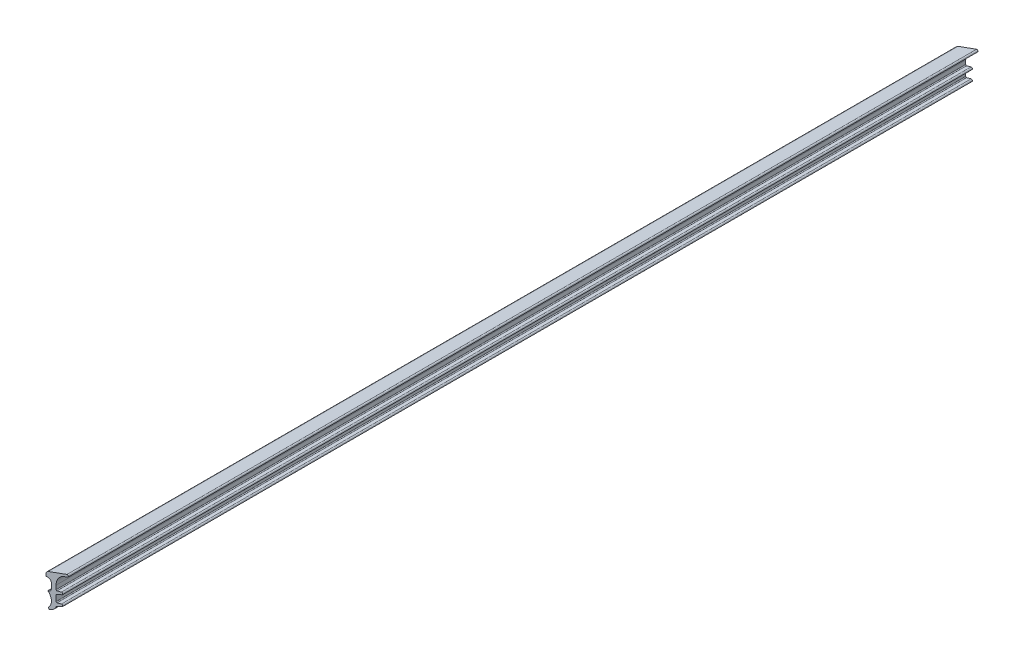
ISO-10303-21;
HEADER;
FILE_DESCRIPTION(('STEP AP214'),'2;1');
FILE_NAME('part.step','',(''),(''),'','','');
FILE_SCHEMA(('AUTOMOTIVE_DESIGN { 1 0 10303 214 1 1 1 1 }'));
ENDSEC;
DATA;
#1=APPLICATION_CONTEXT('core data for automotive mechanical design processes');
#2=APPLICATION_PROTOCOL_DEFINITION('international standard','automotive_design',2000,#1);
#3=PRODUCT_CONTEXT('',#1,'mechanical');
#4=PRODUCT('Part','Part','',(#3));
#5=PRODUCT_RELATED_PRODUCT_CATEGORY('part','',(#4));
#6=PRODUCT_DEFINITION_FORMATION('','',#4);
#7=PRODUCT_DEFINITION_CONTEXT('part definition',#1,'design');
#8=PRODUCT_DEFINITION('design','',#6,#7);
#9=PRODUCT_DEFINITION_SHAPE('','',#8);
#10=(LENGTH_UNIT() NAMED_UNIT(*) SI_UNIT(.MILLI.,.METRE.));
#11=(NAMED_UNIT(*) PLANE_ANGLE_UNIT() SI_UNIT($,.RADIAN.));
#12=(NAMED_UNIT(*) SI_UNIT($,.STERADIAN.) SOLID_ANGLE_UNIT());
#13=UNCERTAINTY_MEASURE_WITH_UNIT(LENGTH_MEASURE(1.E-05),#10,'distance_accuracy_value','');
#14=(GEOMETRIC_REPRESENTATION_CONTEXT(3) GLOBAL_UNCERTAINTY_ASSIGNED_CONTEXT((#13)) GLOBAL_UNIT_ASSIGNED_CONTEXT((#10,
#11,#12)) REPRESENTATION_CONTEXT('',''));
#15=CARTESIAN_POINT('',(0.,0.,0.));
#16=DIRECTION('',(0.,0.,1.));
#17=DIRECTION('',(1.,0.,0.));
#18=AXIS2_PLACEMENT_3D('',#15,#16,#17);
#19=CARTESIAN_POINT('',(-1.78652744552477,1.94857737493925,225.79));
#20=DIRECTION('',(0.,0.,-1.));
#21=DIRECTION('',(-1.,0.,0.));
#22=AXIS2_PLACEMENT_3D('',#19,#20,#21);
#23=CYLINDRICAL_SURFACE('',#22,1.78652744552477);
#24=CARTESIAN_POINT('',(-1.78652744552477,1.94857737493925,-225.79));
#25=DIRECTION('',(0.,0.,-1.));
#26=DIRECTION('',(1.,0.,0.));
#27=AXIS2_PLACEMENT_3D('',#24,#25,#26);
#28=CIRCLE('',#27,1.78652744552477);
#29=CARTESIAN_POINT('',(-1.78652744552477,3.73510482046402,-225.79));
#30=VERTEX_POINT('',#29);
#31=CARTESIAN_POINT('',(0.,1.94857737493925,-225.79));
#32=VERTEX_POINT('',#31);
#33=EDGE_CURVE('E248',#30,#32,#28,.T.);
#34=ORIENTED_EDGE('',*,*,#33,.T.);
#35=DIRECTION('',(0.,0.,-1.));
#36=VECTOR('',#35,1.);
#37=CARTESIAN_POINT('',(0.,1.94857737493925,225.79));
#38=LINE('',#37,#36);
#39=CARTESIAN_POINT('',(0.,1.94857737493925,225.79));
#40=VERTEX_POINT('',#39);
#41=EDGE_CURVE('E11',#40,#32,#38,.T.);
#42=ORIENTED_EDGE('',*,*,#41,.F.);
#43=CARTESIAN_POINT('',(-1.78652744552477,1.94857737493925,225.79));
#44=DIRECTION('',(0.,0.,-1.));
#45=DIRECTION('',(1.,0.,0.));
#46=AXIS2_PLACEMENT_3D('',#43,#44,#45);
#47=CIRCLE('',#46,1.78652744552477);
#48=CARTESIAN_POINT('',(-1.78652744552477,3.73510482046402,225.79));
#49=VERTEX_POINT('',#48);
#50=EDGE_CURVE('E321',#49,#40,#47,.T.);
#51=ORIENTED_EDGE('',*,*,#50,.F.);
#52=DIRECTION('',(0.,0.,-1.));
#53=VECTOR('',#52,1.);
#54=CARTESIAN_POINT('',(-1.78652744552477,3.73510482046402,225.79));
#55=LINE('',#54,#53);
#56=EDGE_CURVE('E244',#49,#30,#55,.T.);
#57=ORIENTED_EDGE('',*,*,#56,.T.);
#58=EDGE_LOOP('',(#34,#42,#51,#57));
#59=FACE_BOUND('',#58,.T.);
#60=ADVANCED_FACE('F45',(#59),#23,.F.);
#61=CARTESIAN_POINT('',(0.,1.94857737493925,225.79));
#62=DIRECTION('',(1.,0.,0.));
#63=DIRECTION('',(0.,1.,0.));
#64=AXIS2_PLACEMENT_3D('',#61,#62,#63);
#65=PLANE('',#64);
#66=DIRECTION('',(0.,-1.,0.));
#67=VECTOR('',#66,1.);
#68=CARTESIAN_POINT('',(0.,1.94857737493925,-225.79));
#69=LINE('',#68,#67);
#70=CARTESIAN_POINT('',(0.,-0.291975050494416,-225.79));
#71=VERTEX_POINT('',#70);
#72=EDGE_CURVE('E252',#32,#71,#69,.T.);
#73=ORIENTED_EDGE('',*,*,#72,.T.);
#74=DIRECTION('',(0.,0.,-1.));
#75=VECTOR('',#74,1.);
#76=CARTESIAN_POINT('',(0.,-0.291975050494416,225.79));
#77=LINE('',#76,#75);
#78=CARTESIAN_POINT('',(0.,-0.291975050494416,225.79));
#79=VERTEX_POINT('',#78);
#80=EDGE_CURVE('E54',#79,#71,#77,.T.);
#81=ORIENTED_EDGE('',*,*,#80,.F.);
#82=DIRECTION('',(0.,-1.,0.));
#83=VECTOR('',#82,1.);
#84=CARTESIAN_POINT('',(0.,1.94857737493925,225.79));
#85=LINE('',#84,#83);
#86=EDGE_CURVE('E156',#40,#79,#85,.T.);
#87=ORIENTED_EDGE('',*,*,#86,.F.);
#88=ORIENTED_EDGE('',*,*,#41,.T.);
#89=EDGE_LOOP('',(#73,#81,#87,#88));
#90=FACE_BOUND('',#89,.T.);
#91=ADVANCED_FACE('F506',(#90),#65,.F.);
#92=CARTESIAN_POINT('',(-1.78652744552476,-0.291975050494416,225.79));
#93=DIRECTION('',(0.,0.,-1.));
#94=DIRECTION('',(-1.,0.,0.));
#95=AXIS2_PLACEMENT_3D('',#92,#93,#94);
#96=CYLINDRICAL_SURFACE('',#95,1.78652744552476);
#97=CARTESIAN_POINT('',(-1.78652744552476,-0.291975050494416,-225.79));
#98=DIRECTION('',(0.,0.,-1.));
#99=DIRECTION('',(1.,0.,0.));
#100=AXIS2_PLACEMENT_3D('',#97,#98,#99);
#101=CIRCLE('',#100,1.78652744552476);
#102=CARTESIAN_POINT('',(-1.78652744552476,-2.07850249601918,-225.79));
#103=VERTEX_POINT('',#102);
#104=EDGE_CURVE('E255',#71,#103,#101,.T.);
#105=ORIENTED_EDGE('',*,*,#104,.T.);
#106=DIRECTION('',(0.,0.,-1.));
#107=VECTOR('',#106,1.);
#108=CARTESIAN_POINT('',(-1.78652744552476,-2.07850249601918,225.79));
#109=LINE('',#108,#107);
#110=CARTESIAN_POINT('',(-1.78652744552476,-2.07850249601918,225.79));
#111=VERTEX_POINT('',#110);
#112=EDGE_CURVE('E400',#111,#103,#109,.T.);
#113=ORIENTED_EDGE('',*,*,#112,.F.);
#114=CARTESIAN_POINT('',(-1.78652744552476,-0.291975050494416,225.79));
#115=DIRECTION('',(0.,0.,-1.));
#116=DIRECTION('',(1.,0.,0.));
#117=AXIS2_PLACEMENT_3D('',#114,#115,#116);
#118=CIRCLE('',#117,1.78652744552476);
#119=EDGE_CURVE('E410',#79,#111,#118,.T.);
#120=ORIENTED_EDGE('',*,*,#119,.F.);
#121=ORIENTED_EDGE('',*,*,#80,.T.);
#122=EDGE_LOOP('',(#105,#113,#120,#121));
#123=FACE_BOUND('',#122,.T.);
#124=ADVANCED_FACE('F408',(#123),#96,.F.);
#125=CARTESIAN_POINT('',(-4.38380391574828,-5.6216307671915,225.79));
#126=DIRECTION('',(0.,0.,-1.));
#127=DIRECTION('',(-1.,0.,0.));
#128=AXIS2_PLACEMENT_3D('',#125,#126,#127);
#129=CYLINDRICAL_SURFACE('',#128,4.39313134435534);
#130=CARTESIAN_POINT('',(-4.38380391574828,-5.6216307671915,-225.79));
#131=DIRECTION('',(0.,0.,-1.));
#132=DIRECTION('',(1.,0.,0.));
#133=AXIS2_PLACEMENT_3D('',#130,#131,#132);
#134=CIRCLE('',#133,4.39313134435534);
#135=CARTESIAN_POINT('',(-1.34801706246346,-8.79709942396965,-225.79));
#136=VERTEX_POINT('',#135);
#137=EDGE_CURVE('E258',#103,#136,#134,.T.);
#138=ORIENTED_EDGE('',*,*,#137,.T.);
#139=DIRECTION('',(0.,0.,-1.));
#140=VECTOR('',#139,1.);
#141=CARTESIAN_POINT('',(-1.34801706246346,-8.79709942396965,225.79));
#142=LINE('',#141,#140);
#143=CARTESIAN_POINT('',(-1.34801706246346,-8.79709942396965,225.79));
#144=VERTEX_POINT('',#143);
#145=EDGE_CURVE('E396',#144,#136,#142,.T.);
#146=ORIENTED_EDGE('',*,*,#145,.F.);
#147=CARTESIAN_POINT('',(-4.38380391574828,-5.6216307671915,225.79));
#148=DIRECTION('',(0.,0.,-1.));
#149=DIRECTION('',(1.,0.,0.));
#150=AXIS2_PLACEMENT_3D('',#147,#148,#149);
#151=CIRCLE('',#150,4.39313134435534);
#152=EDGE_CURVE('E429',#111,#144,#151,.T.);
#153=ORIENTED_EDGE('',*,*,#152,.F.);
#154=ORIENTED_EDGE('',*,*,#112,.T.);
#155=EDGE_LOOP('',(#138,#146,#153,#154));
#156=FACE_BOUND('',#155,.T.);
#157=ADVANCED_FACE('F419',(#156),#129,.F.);
#158=CARTESIAN_POINT('',(-0.97765368561212,-9.18450386033098,225.79));
#159=DIRECTION('',(0.,0.,-1.));
#160=DIRECTION('',(-1.,0.,0.));
#161=AXIS2_PLACEMENT_3D('',#158,#159,#160);
#162=CYLINDRICAL_SURFACE('',#161,0.535958233657416);
#163=CARTESIAN_POINT('',(-0.97765368561212,-9.18450386033098,-225.79));
#164=DIRECTION('',(0.,0.,1.));
#165=DIRECTION('',(1.,0.,0.));
#166=AXIS2_PLACEMENT_3D('',#163,#164,#165);
#167=CIRCLE('',#166,0.535958233657416);
#168=CARTESIAN_POINT('',(-0.82999058633459,-9.69971919136931,-225.79));
#169=VERTEX_POINT('',#168);
#170=EDGE_CURVE('E261',#136,#169,#167,.T.);
#171=ORIENTED_EDGE('',*,*,#170,.T.);
#172=DIRECTION('',(0.,0.,-1.));
#173=VECTOR('',#172,1.);
#174=CARTESIAN_POINT('',(-0.82999058633459,-9.69971919136931,225.79));
#175=LINE('',#174,#173);
#176=CARTESIAN_POINT('',(-0.82999058633459,-9.69971919136931,225.79));
#177=VERTEX_POINT('',#176);
#178=EDGE_CURVE('E392',#177,#169,#175,.T.);
#179=ORIENTED_EDGE('',*,*,#178,.F.);
#180=CARTESIAN_POINT('',(-0.97765368561212,-9.18450386033098,225.79));
#181=DIRECTION('',(0.,0.,1.));
#182=DIRECTION('',(1.,0.,0.));
#183=AXIS2_PLACEMENT_3D('',#180,#181,#182);
#184=CIRCLE('',#183,0.535958233657416);
#185=EDGE_CURVE('E425',#144,#177,#184,.T.);
#186=ORIENTED_EDGE('',*,*,#185,.F.);
#187=ORIENTED_EDGE('',*,*,#145,.T.);
#188=EDGE_LOOP('',(#171,#179,#186,#187));
#189=FACE_BOUND('',#188,.T.);
#190=ADVANCED_FACE('F423',(#189),#162,.T.);
#191=CARTESIAN_POINT('',(-2.18905187352212,-4.95778153459788,225.79));
#192=DIRECTION('',(0.,0.,-1.));
#193=DIRECTION('',(-1.,0.,0.));
#194=AXIS2_PLACEMENT_3D('',#191,#192,#193);
#195=CYLINDRICAL_SURFACE('',#194,4.93285113530084);
#196=CARTESIAN_POINT('',(-2.18905187352212,-4.95778153459788,-225.79));
#197=DIRECTION('',(0.,0.,1.));
#198=DIRECTION('',(1.,0.,0.));
#199=AXIS2_PLACEMENT_3D('',#196,#197,#198);
#200=CIRCLE('',#199,4.93285113530084);
#201=CARTESIAN_POINT('',(2.32248567918233,-6.95253696661863,-225.79));
#202=VERTEX_POINT('',#201);
#203=EDGE_CURVE('E264',#169,#202,#200,.T.);
#204=ORIENTED_EDGE('',*,*,#203,.T.);
#205=DIRECTION('',(0.,0.,-1.));
#206=VECTOR('',#205,1.);
#207=CARTESIAN_POINT('',(2.32248567918233,-6.95253696661863,225.79));
#208=LINE('',#207,#206);
#209=CARTESIAN_POINT('',(2.32248567918233,-6.95253696661863,225.79));
#210=VERTEX_POINT('',#209);
#211=EDGE_CURVE('E388',#210,#202,#208,.T.);
#212=ORIENTED_EDGE('',*,*,#211,.F.);
#213=CARTESIAN_POINT('',(-2.18905187352212,-4.95778153459788,225.79));
#214=DIRECTION('',(0.,0.,1.));
#215=DIRECTION('',(1.,0.,0.));
#216=AXIS2_PLACEMENT_3D('',#213,#214,#215);
#217=CIRCLE('',#216,4.93285113530084);
#218=EDGE_CURVE('E428',#177,#210,#217,.T.);
#219=ORIENTED_EDGE('',*,*,#218,.F.);
#220=ORIENTED_EDGE('',*,*,#178,.T.);
#221=EDGE_LOOP('',(#204,#212,#219,#220));
#222=FACE_BOUND('',#221,.T.);
#223=ADVANCED_FACE('F519',(#222),#195,.T.);
#224=CARTESIAN_POINT('',(2.6797911682873,-6.95253696661863,225.79));
#225=DIRECTION('',(0.,0.,-1.));
#226=DIRECTION('',(-1.,0.,0.));
#227=AXIS2_PLACEMENT_3D('',#224,#225,#226);
#228=CYLINDRICAL_SURFACE('',#227,0.357305489104969);
#229=CARTESIAN_POINT('',(2.6797911682873,-6.95253696661863,-225.79));
#230=DIRECTION('',(0.,0.,-1.));
#231=DIRECTION('',(1.,0.,0.));
#232=AXIS2_PLACEMENT_3D('',#229,#230,#231);
#233=CIRCLE('',#232,0.357305489104969);
#234=CARTESIAN_POINT('',(2.53974358834427,-6.62382145451638,-225.79));
#235=VERTEX_POINT('',#234);
#236=EDGE_CURVE('E267',#202,#235,#233,.T.);
#237=ORIENTED_EDGE('',*,*,#236,.T.);
#238=DIRECTION('',(0.,0.,-1.));
#239=VECTOR('',#238,1.);
#240=CARTESIAN_POINT('',(2.53974358834427,-6.62382145451638,225.79));
#241=LINE('',#240,#239);
#242=CARTESIAN_POINT('',(2.53974358834427,-6.62382145451638,225.79));
#243=VERTEX_POINT('',#242);
#244=EDGE_CURVE('E384',#243,#235,#241,.T.);
#245=ORIENTED_EDGE('',*,*,#244,.F.);
#246=CARTESIAN_POINT('',(2.6797911682873,-6.95253696661863,225.79));
#247=DIRECTION('',(0.,0.,-1.));
#248=DIRECTION('',(1.,0.,0.));
#249=AXIS2_PLACEMENT_3D('',#246,#247,#248);
#250=CIRCLE('',#249,0.357305489104969);
#251=EDGE_CURVE('E433',#210,#243,#250,.T.);
#252=ORIENTED_EDGE('',*,*,#251,.F.);
#253=ORIENTED_EDGE('',*,*,#211,.T.);
#254=EDGE_LOOP('',(#237,#245,#252,#253));
#255=FACE_BOUND('',#254,.T.);
#256=ADVANCED_FACE('F522',(#255),#228,.F.);
#257=CARTESIAN_POINT('',(2.53974358834427,-6.62382145451638,225.79));
#258=DIRECTION('',(-0.391954739609082,0.919984501009651,0.));
#259=DIRECTION('',(-0.919984501009651,-0.391954739609082,0.));
#260=AXIS2_PLACEMENT_3D('',#257,#258,#259);
#261=PLANE('',#260);
#262=DIRECTION('',(0.919984501009651,0.391954739609082,0.));
#263=VECTOR('',#262,1.);
#264=CARTESIAN_POINT('',(2.53974358834427,-6.62382145451638,-225.79));
#265=LINE('',#264,#263);
#266=CARTESIAN_POINT('',(5.30072267607704,-5.44752029051768,-225.79));
#267=VERTEX_POINT('',#266);
#268=EDGE_CURVE('E270',#235,#267,#265,.T.);
#269=ORIENTED_EDGE('',*,*,#268,.T.);
#270=DIRECTION('',(0.,0.,-1.));
#271=VECTOR('',#270,1.);
#272=CARTESIAN_POINT('',(5.30072267607704,-5.44752029051768,225.79));
#273=LINE('',#272,#271);
#274=CARTESIAN_POINT('',(5.30072267607704,-5.44752029051768,225.79));
#275=VERTEX_POINT('',#274);
#276=EDGE_CURVE('E380',#275,#267,#273,.T.);
#277=ORIENTED_EDGE('',*,*,#276,.F.);
#278=DIRECTION('',(0.919984501009651,0.391954739609082,0.));
#279=VECTOR('',#278,1.);
#280=CARTESIAN_POINT('',(2.53974358834427,-6.62382145451638,225.79));
#281=LINE('',#280,#279);
#282=EDGE_CURVE('E440',#243,#275,#281,.T.);
#283=ORIENTED_EDGE('',*,*,#282,.F.);
#284=ORIENTED_EDGE('',*,*,#244,.T.);
#285=EDGE_LOOP('',(#269,#277,#283,#284));
#286=FACE_BOUND('',#285,.T.);
#287=ADVANCED_FACE('F526',(#286),#261,.F.);
#288=CARTESIAN_POINT('',(5.0906513061625,-4.95444702236435,225.79));
#289=DIRECTION('',(0.,0.,-1.));
#290=DIRECTION('',(-1.,0.,0.));
#291=AXIS2_PLACEMENT_3D('',#288,#289,#290);
#292=CYLINDRICAL_SURFACE('',#291,0.535958233657415);
#293=CARTESIAN_POINT('',(5.0906513061625,-4.95444702236435,-225.79));
#294=DIRECTION('',(0.,0.,1.));
#295=DIRECTION('',(1.,0.,0.));
#296=AXIS2_PLACEMENT_3D('',#293,#294,#295);
#297=CIRCLE('',#296,0.535958233657415);
#298=CARTESIAN_POINT('',(4.94912002109639,-4.43751363828792,-225.79));
#299=VERTEX_POINT('',#298);
#300=EDGE_CURVE('E273',#267,#299,#297,.T.);
#301=ORIENTED_EDGE('',*,*,#300,.T.);
#302=DIRECTION('',(0.,0.,-1.));
#303=VECTOR('',#302,1.);
#304=CARTESIAN_POINT('',(4.94912002109639,-4.43751363828792,225.79));
#305=LINE('',#304,#303);
#306=CARTESIAN_POINT('',(4.94912002109639,-4.43751363828792,225.79));
#307=VERTEX_POINT('',#306);
#308=EDGE_CURVE('E376',#307,#299,#305,.T.);
#309=ORIENTED_EDGE('',*,*,#308,.F.);
#310=CARTESIAN_POINT('',(5.0906513061625,-4.95444702236435,225.79));
#311=DIRECTION('',(0.,0.,1.));
#312=DIRECTION('',(1.,0.,0.));
#313=AXIS2_PLACEMENT_3D('',#310,#311,#312);
#314=CIRCLE('',#313,0.535958233657415);
#315=EDGE_CURVE('E443',#275,#307,#314,.T.);
#316=ORIENTED_EDGE('',*,*,#315,.F.);
#317=ORIENTED_EDGE('',*,*,#276,.T.);
#318=EDGE_LOOP('',(#301,#309,#316,#317));
#319=FACE_BOUND('',#318,.T.);
#320=ADVANCED_FACE('F530',(#319),#292,.T.);
#321=CARTESIAN_POINT('',(4.94912002109639,-4.43751363828792,225.79));
#322=DIRECTION('',(0.2640714820263,-0.964503111648912,0.));
#323=DIRECTION('',(0.964503111648912,0.2640714820263,0.));
#324=AXIS2_PLACEMENT_3D('',#321,#322,#323);
#325=PLANE('',#324);
#326=DIRECTION('',(-0.964503111648912,-0.2640714820263,0.));
#327=VECTOR('',#326,1.);
#328=CARTESIAN_POINT('',(4.94912002109639,-4.43751363828792,-225.79));
#329=LINE('',#328,#327);
#330=CARTESIAN_POINT('',(2.77414535833138,-5.03300034603332,-225.79));
#331=VERTEX_POINT('',#330);
#332=EDGE_CURVE('E276',#299,#331,#329,.T.);
#333=ORIENTED_EDGE('',*,*,#332,.T.);
#334=DIRECTION('',(0.,0.,-1.));
#335=VECTOR('',#334,1.);
#336=CARTESIAN_POINT('',(2.77414535833138,-5.03300034603332,225.79));
#337=LINE('',#336,#335);
#338=CARTESIAN_POINT('',(2.77414535833138,-5.03300034603332,225.79));
#339=VERTEX_POINT('',#338);
#340=EDGE_CURVE('E372',#339,#331,#337,.T.);
#341=ORIENTED_EDGE('',*,*,#340,.F.);
#342=DIRECTION('',(-0.964503111648912,-0.2640714820263,0.));
#343=VECTOR('',#342,1.);
#344=CARTESIAN_POINT('',(4.94912002109639,-4.43751363828792,225.79));
#345=LINE('',#344,#343);
#346=EDGE_CURVE('E446',#307,#339,#345,.T.);
#347=ORIENTED_EDGE('',*,*,#346,.F.);
#348=ORIENTED_EDGE('',*,*,#308,.T.);
#349=EDGE_LOOP('',(#333,#341,#347,#348));
#350=FACE_BOUND('',#349,.T.);
#351=ADVANCED_FACE('F534',(#350),#325,.F.);
#352=CARTESIAN_POINT('',(2.6797911682873,-4.68837808998234,225.79));
#353=DIRECTION('',(0.,0.,-1.));
#354=DIRECTION('',(-1.,0.,0.));
#355=AXIS2_PLACEMENT_3D('',#352,#353,#354);
#356=CYLINDRICAL_SURFACE('',#355,0.357305489104968);
#357=CARTESIAN_POINT('',(2.6797911682873,-4.68837808998234,-225.79));
#358=DIRECTION('',(0.,0.,-1.));
#359=DIRECTION('',(1.,0.,0.));
#360=AXIS2_PLACEMENT_3D('',#357,#358,#359);
#361=CIRCLE('',#360,0.357305489104968);
#362=CARTESIAN_POINT('',(2.32248567918233,-4.68837808998234,-225.79));
#363=VERTEX_POINT('',#362);
#364=EDGE_CURVE('E279',#331,#363,#361,.T.);
#365=ORIENTED_EDGE('',*,*,#364,.T.);
#366=DIRECTION('',(0.,0.,-1.));
#367=VECTOR('',#366,1.);
#368=CARTESIAN_POINT('',(2.32248567918233,-4.68837808998234,225.79));
#369=LINE('',#368,#367);
#370=CARTESIAN_POINT('',(2.32248567918233,-4.68837808998234,225.79));
#371=VERTEX_POINT('',#370);
#372=EDGE_CURVE('E368',#371,#363,#369,.T.);
#373=ORIENTED_EDGE('',*,*,#372,.F.);
#374=CARTESIAN_POINT('',(2.6797911682873,-4.68837808998234,225.79));
#375=DIRECTION('',(0.,0.,-1.));
#376=DIRECTION('',(1.,0.,0.));
#377=AXIS2_PLACEMENT_3D('',#374,#375,#376);
#378=CIRCLE('',#377,0.357305489104968);
#379=EDGE_CURVE('E449',#339,#371,#378,.T.);
#380=ORIENTED_EDGE('',*,*,#379,.F.);
#381=ORIENTED_EDGE('',*,*,#340,.T.);
#382=EDGE_LOOP('',(#365,#373,#380,#381));
#383=FACE_BOUND('',#382,.T.);
#384=ADVANCED_FACE('F538',(#383),#356,.F.);
#385=CARTESIAN_POINT('',(2.32248567918233,-4.68837808998234,225.79));
#386=DIRECTION('',(-1.,0.,0.));
#387=DIRECTION('',(0.,-1.,0.));
#388=AXIS2_PLACEMENT_3D('',#385,#386,#387);
#389=PLANE('',#388);
#390=DIRECTION('',(0.,1.,0.));
#391=VECTOR('',#390,1.);
#392=CARTESIAN_POINT('',(2.32248567918233,-4.68837808998234,-225.79));
#393=LINE('',#392,#391);
#394=CARTESIAN_POINT('',(2.32248567918233,-1.8190303702324,-225.79));
#395=VERTEX_POINT('',#394);
#396=EDGE_CURVE('E282',#363,#395,#393,.T.);
#397=ORIENTED_EDGE('',*,*,#396,.T.);
#398=DIRECTION('',(0.,0.,-1.));
#399=VECTOR('',#398,1.);
#400=CARTESIAN_POINT('',(2.32248567918233,-1.8190303702324,225.79));
#401=LINE('',#400,#399);
#402=CARTESIAN_POINT('',(2.32248567918233,-1.8190303702324,225.79));
#403=VERTEX_POINT('',#402);
#404=EDGE_CURVE('E364',#403,#395,#401,.T.);
#405=ORIENTED_EDGE('',*,*,#404,.F.);
#406=DIRECTION('',(0.,1.,0.));
#407=VECTOR('',#406,1.);
#408=CARTESIAN_POINT('',(2.32248567918233,-4.68837808998234,225.79));
#409=LINE('',#408,#407);
#410=EDGE_CURVE('E452',#371,#403,#409,.T.);
#411=ORIENTED_EDGE('',*,*,#410,.F.);
#412=ORIENTED_EDGE('',*,*,#372,.T.);
#413=EDGE_LOOP('',(#397,#405,#411,#412));
#414=FACE_BOUND('',#413,.T.);
#415=ADVANCED_FACE('F542',(#414),#389,.F.);
#416=CARTESIAN_POINT('',(2.6797911682873,-1.8190303702324,225.79));
#417=DIRECTION('',(0.,0.,-1.));
#418=DIRECTION('',(-1.,0.,0.));
#419=AXIS2_PLACEMENT_3D('',#416,#417,#418);
#420=CYLINDRICAL_SURFACE('',#419,0.357305489104968);
#421=CARTESIAN_POINT('',(2.6797911682873,-1.8190303702324,-225.79));
#422=DIRECTION('',(0.,0.,-1.));
#423=DIRECTION('',(1.,0.,0.));
#424=AXIS2_PLACEMENT_3D('',#421,#422,#423);
#425=CIRCLE('',#424,0.357305489104968);
#426=CARTESIAN_POINT('',(2.53974358834427,-1.49031485813016,-225.79));
#427=VERTEX_POINT('',#426);
#428=EDGE_CURVE('E285',#395,#427,#425,.T.);
#429=ORIENTED_EDGE('',*,*,#428,.T.);
#430=DIRECTION('',(0.,0.,-1.));
#431=VECTOR('',#430,1.);
#432=CARTESIAN_POINT('',(2.53974358834427,-1.49031485813016,225.79));
#433=LINE('',#432,#431);
#434=CARTESIAN_POINT('',(2.53974358834427,-1.49031485813016,225.79));
#435=VERTEX_POINT('',#434);
#436=EDGE_CURVE('E360',#435,#427,#433,.T.);
#437=ORIENTED_EDGE('',*,*,#436,.F.);
#438=CARTESIAN_POINT('',(2.6797911682873,-1.8190303702324,225.79));
#439=DIRECTION('',(0.,0.,-1.));
#440=DIRECTION('',(1.,0.,0.));
#441=AXIS2_PLACEMENT_3D('',#438,#439,#440);
#442=CIRCLE('',#441,0.357305489104968);
#443=EDGE_CURVE('E455',#403,#435,#442,.T.);
#444=ORIENTED_EDGE('',*,*,#443,.F.);
#445=ORIENTED_EDGE('',*,*,#404,.T.);
#446=EDGE_LOOP('',(#429,#437,#444,#445));
#447=FACE_BOUND('',#446,.T.);
#448=ADVANCED_FACE('F546',(#447),#420,.F.);
#449=CARTESIAN_POINT('',(2.53974358834427,-1.49031485813016,225.79));
#450=DIRECTION('',(-0.391954739609082,0.919984501009651,0.));
#451=DIRECTION('',(-0.919984501009651,-0.391954739609082,0.));
#452=AXIS2_PLACEMENT_3D('',#449,#450,#451);
#453=PLANE('',#452);
#454=DIRECTION('',(0.919984501009651,0.391954739609082,0.));
#455=VECTOR('',#454,1.);
#456=CARTESIAN_POINT('',(2.53974358834427,-1.49031485813016,-225.79));
#457=LINE('',#456,#455);
#458=CARTESIAN_POINT('',(5.30072267607704,-0.314013694131456,-225.79));
#459=VERTEX_POINT('',#458);
#460=EDGE_CURVE('E288',#427,#459,#457,.T.);
#461=ORIENTED_EDGE('',*,*,#460,.T.);
#462=DIRECTION('',(0.,0.,-1.));
#463=VECTOR('',#462,1.);
#464=CARTESIAN_POINT('',(5.30072267607704,-0.314013694131456,225.79));
#465=LINE('',#464,#463);
#466=CARTESIAN_POINT('',(5.30072267607704,-0.314013694131456,225.79));
#467=VERTEX_POINT('',#466);
#468=EDGE_CURVE('E356',#467,#459,#465,.T.);
#469=ORIENTED_EDGE('',*,*,#468,.F.);
#470=DIRECTION('',(0.919984501009651,0.391954739609082,0.));
#471=VECTOR('',#470,1.);
#472=CARTESIAN_POINT('',(2.53974358834427,-1.49031485813016,225.79));
#473=LINE('',#472,#471);
#474=EDGE_CURVE('E458',#435,#467,#473,.T.);
#475=ORIENTED_EDGE('',*,*,#474,.F.);
#476=ORIENTED_EDGE('',*,*,#436,.T.);
#477=EDGE_LOOP('',(#461,#469,#475,#476));
#478=FACE_BOUND('',#477,.T.);
#479=ADVANCED_FACE('F550',(#478),#453,.F.);
#480=CARTESIAN_POINT('',(5.0906513061625,0.179059574021876,225.79));
#481=DIRECTION('',(0.,0.,-1.));
#482=DIRECTION('',(-1.,0.,0.));
#483=AXIS2_PLACEMENT_3D('',#480,#481,#482);
#484=CYLINDRICAL_SURFACE('',#483,0.535958233657416);
#485=CARTESIAN_POINT('',(5.0906513061625,0.179059574021876,-225.79));
#486=DIRECTION('',(0.,0.,1.));
#487=DIRECTION('',(1.,0.,0.));
#488=AXIS2_PLACEMENT_3D('',#485,#486,#487);
#489=CIRCLE('',#488,0.535958233657416);
#490=CARTESIAN_POINT('',(4.94912002109639,0.695992958098308,-225.79));
#491=VERTEX_POINT('',#490);
#492=EDGE_CURVE('E291',#459,#491,#489,.T.);
#493=ORIENTED_EDGE('',*,*,#492,.T.);
#494=DIRECTION('',(0.,0.,-1.));
#495=VECTOR('',#494,1.);
#496=CARTESIAN_POINT('',(4.94912002109639,0.695992958098308,225.79));
#497=LINE('',#496,#495);
#498=CARTESIAN_POINT('',(4.94912002109639,0.695992958098308,225.79));
#499=VERTEX_POINT('',#498);
#500=EDGE_CURVE('E352',#499,#491,#497,.T.);
#501=ORIENTED_EDGE('',*,*,#500,.F.);
#502=CARTESIAN_POINT('',(5.0906513061625,0.179059574021876,225.79));
#503=DIRECTION('',(0.,0.,1.));
#504=DIRECTION('',(1.,0.,0.));
#505=AXIS2_PLACEMENT_3D('',#502,#503,#504);
#506=CIRCLE('',#505,0.535958233657416);
#507=EDGE_CURVE('E461',#467,#499,#506,.T.);
#508=ORIENTED_EDGE('',*,*,#507,.F.);
#509=ORIENTED_EDGE('',*,*,#468,.T.);
#510=EDGE_LOOP('',(#493,#501,#508,#509));
#511=FACE_BOUND('',#510,.T.);
#512=ADVANCED_FACE('F554',(#511),#484,.T.);
#513=CARTESIAN_POINT('',(4.94912002109639,0.695992958098308,225.79));
#514=DIRECTION('',(0.2640714820263,-0.964503111648912,0.));
#515=DIRECTION('',(0.964503111648912,0.2640714820263,0.));
#516=AXIS2_PLACEMENT_3D('',#513,#514,#515);
#517=PLANE('',#516);
#518=DIRECTION('',(-0.964503111648912,-0.2640714820263,0.));
#519=VECTOR('',#518,1.);
#520=CARTESIAN_POINT('',(4.94912002109639,0.695992958098308,-225.79));
#521=LINE('',#520,#519);
#522=CARTESIAN_POINT('',(2.77414535833138,0.100506250352905,-225.79));
#523=VERTEX_POINT('',#522);
#524=EDGE_CURVE('E294',#491,#523,#521,.T.);
#525=ORIENTED_EDGE('',*,*,#524,.T.);
#526=DIRECTION('',(0.,0.,-1.));
#527=VECTOR('',#526,1.);
#528=CARTESIAN_POINT('',(2.77414535833138,0.100506250352905,225.79));
#529=LINE('',#528,#527);
#530=CARTESIAN_POINT('',(2.77414535833138,0.100506250352905,225.79));
#531=VERTEX_POINT('',#530);
#532=EDGE_CURVE('E348',#531,#523,#529,.T.);
#533=ORIENTED_EDGE('',*,*,#532,.F.);
#534=DIRECTION('',(-0.964503111648912,-0.2640714820263,0.));
#535=VECTOR('',#534,1.);
#536=CARTESIAN_POINT('',(4.94912002109639,0.695992958098308,225.79));
#537=LINE('',#536,#535);
#538=EDGE_CURVE('E464',#499,#531,#537,.T.);
#539=ORIENTED_EDGE('',*,*,#538,.F.);
#540=ORIENTED_EDGE('',*,*,#500,.T.);
#541=EDGE_LOOP('',(#525,#533,#539,#540));
#542=FACE_BOUND('',#541,.T.);
#543=ADVANCED_FACE('F558',(#542),#517,.F.);
#544=CARTESIAN_POINT('',(2.67979116828728,0.445128506403883,225.79));
#545=DIRECTION('',(0.,0.,-1.));
#546=DIRECTION('',(-1.,0.,0.));
#547=AXIS2_PLACEMENT_3D('',#544,#545,#546);
#548=CYLINDRICAL_SURFACE('',#547,0.357305489104973);
#549=CARTESIAN_POINT('',(2.67979116828728,0.445128506403883,-225.79));
#550=DIRECTION('',(0.,0.,-1.));
#551=DIRECTION('',(1.,0.,0.));
#552=AXIS2_PLACEMENT_3D('',#549,#550,#551);
#553=CIRCLE('',#552,0.357305489104973);
#554=CARTESIAN_POINT('',(2.3224856791823,0.445128506403883,-225.79));
#555=VERTEX_POINT('',#554);
#556=EDGE_CURVE('E297',#523,#555,#553,.T.);
#557=ORIENTED_EDGE('',*,*,#556,.T.);
#558=DIRECTION('',(0.,0.,-1.));
#559=VECTOR('',#558,1.);
#560=CARTESIAN_POINT('',(2.3224856791823,0.445128506403883,225.79));
#561=LINE('',#560,#559);
#562=CARTESIAN_POINT('',(2.3224856791823,0.445128506403883,225.79));
#563=VERTEX_POINT('',#562);
#564=EDGE_CURVE('E344',#563,#555,#561,.T.);
#565=ORIENTED_EDGE('',*,*,#564,.F.);
#566=CARTESIAN_POINT('',(2.67979116828728,0.445128506403883,225.79));
#567=DIRECTION('',(0.,0.,-1.));
#568=DIRECTION('',(1.,0.,0.));
#569=AXIS2_PLACEMENT_3D('',#566,#567,#568);
#570=CIRCLE('',#569,0.357305489104973);
#571=EDGE_CURVE('E467',#531,#563,#570,.T.);
#572=ORIENTED_EDGE('',*,*,#571,.F.);
#573=ORIENTED_EDGE('',*,*,#532,.T.);
#574=EDGE_LOOP('',(#557,#565,#572,#573));
#575=FACE_BOUND('',#574,.T.);
#576=ADVANCED_FACE('F562',(#575),#548,.F.);
#577=CARTESIAN_POINT('',(2.3224856791823,0.445128506403883,225.79));
#578=DIRECTION('',(-1.,0.,0.));
#579=DIRECTION('',(0.,-1.,0.));
#580=AXIS2_PLACEMENT_3D('',#577,#578,#579);
#581=PLANE('',#580);
#582=DIRECTION('',(0.,1.,0.));
#583=VECTOR('',#582,1.);
#584=CARTESIAN_POINT('',(2.3224856791823,0.445128506403883,-225.79));
#585=LINE('',#584,#583);
#586=CARTESIAN_POINT('',(2.32248567918212,2.3526736292607,-225.79));
#587=VERTEX_POINT('',#586);
#588=EDGE_CURVE('E300',#555,#587,#585,.T.);
#589=ORIENTED_EDGE('',*,*,#588,.T.);
#590=DIRECTION('',(0.,0.,-1.));
#591=VECTOR('',#590,1.);
#592=CARTESIAN_POINT('',(2.32248567918212,2.3526736292607,225.79));
#593=LINE('',#592,#591);
#594=CARTESIAN_POINT('',(2.32248567918212,2.3526736292607,225.79));
#595=VERTEX_POINT('',#594);
#596=EDGE_CURVE('E340',#595,#587,#593,.T.);
#597=ORIENTED_EDGE('',*,*,#596,.F.);
#598=DIRECTION('',(0.,1.,0.));
#599=VECTOR('',#598,1.);
#600=CARTESIAN_POINT('',(2.3224856791823,0.445128506403883,225.79));
#601=LINE('',#600,#599);
#602=EDGE_CURVE('E470',#563,#595,#601,.T.);
#603=ORIENTED_EDGE('',*,*,#602,.F.);
#604=ORIENTED_EDGE('',*,*,#564,.T.);
#605=EDGE_LOOP('',(#589,#597,#603,#604));
#606=FACE_BOUND('',#605,.T.);
#607=ADVANCED_FACE('F566',(#606),#581,.F.);
#608=CARTESIAN_POINT('',(8.32961084404232,2.3526736292607,225.79));
#609=DIRECTION('',(0.,0.,-1.));
#610=DIRECTION('',(-1.,0.,0.));
#611=AXIS2_PLACEMENT_3D('',#608,#609,#610);
#612=CYLINDRICAL_SURFACE('',#611,6.00712516486019);
#613=CARTESIAN_POINT('',(8.32961084404232,2.3526736292607,-225.79));
#614=DIRECTION('',(0.,0.,-1.));
#615=DIRECTION('',(1.,0.,0.));
#616=AXIS2_PLACEMENT_3D('',#613,#614,#615);
#617=CIRCLE('',#616,6.00712516486019);
#618=CARTESIAN_POINT('',(6.27505303418189,7.99752481881726,-225.79));
#619=VERTEX_POINT('',#618);
#620=EDGE_CURVE('E303',#587,#619,#617,.T.);
#621=ORIENTED_EDGE('',*,*,#620,.T.);
#622=DIRECTION('',(0.,0.,-1.));
#623=VECTOR('',#622,1.);
#624=CARTESIAN_POINT('',(6.27505303418189,7.99752481881726,225.79));
#625=LINE('',#624,#623);
#626=CARTESIAN_POINT('',(6.27505303418189,7.99752481881726,225.79));
#627=VERTEX_POINT('',#626);
#628=EDGE_CURVE('E336',#627,#619,#625,.T.);
#629=ORIENTED_EDGE('',*,*,#628,.F.);
#630=CARTESIAN_POINT('',(8.32961084404232,2.3526736292607,225.79));
#631=DIRECTION('',(0.,0.,-1.));
#632=DIRECTION('',(1.,0.,0.));
#633=AXIS2_PLACEMENT_3D('',#630,#631,#632);
#634=CIRCLE('',#633,6.00712516486019);
#635=EDGE_CURVE('E473',#595,#627,#634,.T.);
#636=ORIENTED_EDGE('',*,*,#635,.F.);
#637=ORIENTED_EDGE('',*,*,#596,.T.);
#638=EDGE_LOOP('',(#621,#629,#636,#637));
#639=FACE_BOUND('',#638,.T.);
#640=ADVANCED_FACE('F570',(#639),#612,.F.);
#641=CARTESIAN_POINT('',(6.2750530341819,7.99752481881725,225.79));
#642=DIRECTION('',(-0.342020143325631,0.939692620785922,0.));
#643=DIRECTION('',(-0.939692620785922,-0.342020143325631,0.));
#644=AXIS2_PLACEMENT_3D('',#641,#642,#643);
#645=PLANE('',#644);
#646=DIRECTION('',(0.939692620785922,0.342020143325631,0.));
#647=VECTOR('',#646,1.);
#648=CARTESIAN_POINT('',(6.2750530341819,7.99752481881725,-225.79));
#649=LINE('',#648,#647);
#650=CARTESIAN_POINT('',(8.06755910994663,8.64994367513685,-225.79));
#651=VERTEX_POINT('',#650);
#652=EDGE_CURVE('E306',#619,#651,#649,.T.);
#653=ORIENTED_EDGE('',*,*,#652,.T.);
#654=DIRECTION('',(0.,0.,-1.));
#655=VECTOR('',#654,1.);
#656=CARTESIAN_POINT('',(8.06755910994663,8.64994367513685,225.79));
#657=LINE('',#656,#655);
#658=CARTESIAN_POINT('',(8.06755910994663,8.64994367513685,225.79));
#659=VERTEX_POINT('',#658);
#660=EDGE_CURVE('E332',#659,#651,#657,.T.);
#661=ORIENTED_EDGE('',*,*,#660,.F.);
#662=DIRECTION('',(0.939692620785922,0.342020143325631,0.));
#663=VECTOR('',#662,1.);
#664=CARTESIAN_POINT('',(6.2750530341819,7.99752481881725,225.79));
#665=LINE('',#664,#663);
#666=EDGE_CURVE('E476',#627,#659,#665,.T.);
#667=ORIENTED_EDGE('',*,*,#666,.F.);
#668=ORIENTED_EDGE('',*,*,#628,.T.);
#669=EDGE_LOOP('',(#653,#661,#667,#668));
#670=FACE_BOUND('',#669,.T.);
#671=ADVANCED_FACE('F574',(#670),#645,.F.);
#672=CARTESIAN_POINT('',(7.88425059805453,9.15357967235418,225.79));
#673=DIRECTION('',(0.,0.,-1.));
#674=DIRECTION('',(-1.,0.,0.));
#675=AXIS2_PLACEMENT_3D('',#672,#673,#674);
#676=CYLINDRICAL_SURFACE('',#675,0.535958233657423);
#677=CARTESIAN_POINT('',(7.88425059805453,9.15357967235418,-225.79));
#678=DIRECTION('',(0.,0.,1.));
#679=DIRECTION('',(1.,0.,0.));
#680=AXIS2_PLACEMENT_3D('',#677,#678,#679);
#681=CIRCLE('',#680,0.535958233657423);
#682=CARTESIAN_POINT('',(7.70094208616247,9.65721566957152,-225.79));
#683=VERTEX_POINT('',#682);
#684=EDGE_CURVE('E309',#651,#683,#681,.T.);
#685=ORIENTED_EDGE('',*,*,#684,.T.);
#686=DIRECTION('',(0.,0.,-1.));
#687=VECTOR('',#686,1.);
#688=CARTESIAN_POINT('',(7.70094208616247,9.65721566957152,225.79));
#689=LINE('',#688,#687);
#690=CARTESIAN_POINT('',(7.70094208616247,9.65721566957152,225.79));
#691=VERTEX_POINT('',#690);
#692=EDGE_CURVE('E328',#691,#683,#689,.T.);
#693=ORIENTED_EDGE('',*,*,#692,.F.);
#694=CARTESIAN_POINT('',(7.88425059805453,9.15357967235418,225.79));
#695=DIRECTION('',(0.,0.,1.));
#696=DIRECTION('',(1.,0.,0.));
#697=AXIS2_PLACEMENT_3D('',#694,#695,#696);
#698=CIRCLE('',#697,0.535958233657423);
#699=EDGE_CURVE('E479',#659,#691,#698,.T.);
#700=ORIENTED_EDGE('',*,*,#699,.F.);
#701=ORIENTED_EDGE('',*,*,#660,.T.);
#702=EDGE_LOOP('',(#685,#693,#700,#701));
#703=FACE_BOUND('',#702,.T.);
#704=ADVANCED_FACE('F487',(#703),#676,.T.);
#705=CARTESIAN_POINT('',(7.70094208616247,9.65721566957152,225.79));
#706=DIRECTION('',(0.342020143325654,-0.939692620785914,0.));
#707=DIRECTION('',(0.939692620785914,0.342020143325654,0.));
#708=AXIS2_PLACEMENT_3D('',#705,#706,#707);
#709=PLANE('',#708);
#710=DIRECTION('',(-0.939692620785914,-0.342020143325654,0.));
#711=VECTOR('',#710,1.);
#712=CARTESIAN_POINT('',(7.70094208616247,9.65721566957152,-225.79));
#713=LINE('',#712,#711);
#714=CARTESIAN_POINT('',(-1.50429209573686,6.30678442791053,-225.79));
#715=VERTEX_POINT('',#714);
#716=EDGE_CURVE('E312',#683,#715,#713,.T.);
#717=ORIENTED_EDGE('',*,*,#716,.T.);
#718=DIRECTION('',(0.,0.,-1.));
#719=VECTOR('',#718,1.);
#720=CARTESIAN_POINT('',(-1.50429209573686,6.30678442791053,225.79));
#721=LINE('',#720,#719);
#722=CARTESIAN_POINT('',(-1.50429209573686,6.30678442791053,225.79));
#723=VERTEX_POINT('',#722);
#724=EDGE_CURVE('E237',#723,#715,#721,.T.);
#725=ORIENTED_EDGE('',*,*,#724,.F.);
#726=DIRECTION('',(-0.939692620785914,-0.342020143325654,0.));
#727=VECTOR('',#726,1.);
#728=CARTESIAN_POINT('',(7.70094208616247,9.65721566957152,225.79));
#729=LINE('',#728,#727);
#730=EDGE_CURVE('E226',#691,#723,#729,.T.);
#731=ORIENTED_EDGE('',*,*,#730,.F.);
#732=ORIENTED_EDGE('',*,*,#692,.T.);
#733=EDGE_LOOP('',(#717,#725,#731,#732));
#734=FACE_BOUND('',#733,.T.);
#735=ADVANCED_FACE('F491',(#734),#709,.F.);
#736=CARTESIAN_POINT('',(-0.893263722763475,4.62799777051939,225.79));
#737=DIRECTION('',(0.,0.,-1.));
#738=DIRECTION('',(-1.,0.,0.));
#739=AXIS2_PLACEMENT_3D('',#736,#737,#738);
#740=CYLINDRICAL_SURFACE('',#739,1.78652744552471);
#741=CARTESIAN_POINT('',(-0.893263722763475,4.62799777051939,-225.79));
#742=DIRECTION('',(0.,0.,1.));
#743=DIRECTION('',(1.,0.,0.));
#744=AXIS2_PLACEMENT_3D('',#741,#742,#743);
#745=CIRCLE('',#744,1.78652744552471);
#746=CARTESIAN_POINT('',(-2.67979116828818,4.62799777051939,-225.79));
#747=VERTEX_POINT('',#746);
#748=EDGE_CURVE('E235',#715,#747,#745,.T.);
#749=ORIENTED_EDGE('',*,*,#748,.T.);
#750=DIRECTION('',(0.,0.,-1.));
#751=VECTOR('',#750,1.);
#752=CARTESIAN_POINT('',(-2.67979116828818,4.62799777051939,225.79));
#753=LINE('',#752,#751);
#754=CARTESIAN_POINT('',(-2.67979116828818,4.62799777051939,225.79));
#755=VERTEX_POINT('',#754);
#756=EDGE_CURVE('E232',#755,#747,#753,.T.);
#757=ORIENTED_EDGE('',*,*,#756,.F.);
#758=CARTESIAN_POINT('',(-0.893263722763475,4.62799777051939,225.79));
#759=DIRECTION('',(0.,0.,1.));
#760=DIRECTION('',(1.,0.,0.));
#761=AXIS2_PLACEMENT_3D('',#758,#759,#760);
#762=CIRCLE('',#761,1.78652744552471);
#763=EDGE_CURVE('E220',#723,#755,#762,.T.);
#764=ORIENTED_EDGE('',*,*,#763,.F.);
#765=ORIENTED_EDGE('',*,*,#724,.T.);
#766=EDGE_LOOP('',(#749,#757,#764,#765));
#767=FACE_BOUND('',#766,.T.);
#768=ADVANCED_FACE('F233',(#767),#740,.T.);
#769=CARTESIAN_POINT('',(-2.67979116828819,4.62799777051939,225.79));
#770=DIRECTION('',(1.,0.,0.));
#771=DIRECTION('',(0.,1.,0.));
#772=AXIS2_PLACEMENT_3D('',#769,#770,#771);
#773=PLANE('',#772);
#774=DIRECTION('',(0.,-1.,0.));
#775=VECTOR('',#774,1.);
#776=CARTESIAN_POINT('',(-2.67979116828819,4.62799777051939,-225.79));
#777=LINE('',#776,#775);
#778=CARTESIAN_POINT('',(-2.67979116828824,3.73510482046402,-225.79));
#779=VERTEX_POINT('',#778);
#780=EDGE_CURVE('E142',#747,#779,#777,.T.);
#781=ORIENTED_EDGE('',*,*,#780,.T.);
#782=DIRECTION('',(0.,0.,-1.));
#783=VECTOR('',#782,1.);
#784=CARTESIAN_POINT('',(-2.67979116828824,3.73510482046402,225.79));
#785=LINE('',#784,#783);
#786=CARTESIAN_POINT('',(-2.67979116828824,3.73510482046402,225.79));
#787=VERTEX_POINT('',#786);
#788=EDGE_CURVE('E238',#787,#779,#785,.T.);
#789=ORIENTED_EDGE('',*,*,#788,.F.);
#790=DIRECTION('',(0.,-1.,0.));
#791=VECTOR('',#790,1.);
#792=CARTESIAN_POINT('',(-2.67979116828819,4.62799777051939,225.79));
#793=LINE('',#792,#791);
#794=EDGE_CURVE('E224',#755,#787,#793,.T.);
#795=ORIENTED_EDGE('',*,*,#794,.F.);
#796=ORIENTED_EDGE('',*,*,#756,.T.);
#797=EDGE_LOOP('',(#781,#789,#795,#796));
#798=FACE_BOUND('',#797,.T.);
#799=ADVANCED_FACE('F240',(#798),#773,.F.);
#800=CARTESIAN_POINT('',(-2.67979116828824,3.73510482046402,225.79));
#801=DIRECTION('',(0.,1.,0.));
#802=DIRECTION('',(0.,0.,1.));
#803=AXIS2_PLACEMENT_3D('',#800,#801,#802);
#804=PLANE('',#803);
#805=DIRECTION('',(1.,0.,0.));
#806=VECTOR('',#805,1.);
#807=CARTESIAN_POINT('',(-2.67979116828824,3.73510482046402,-225.79));
#808=LINE('',#807,#806);
#809=EDGE_CURVE('E148',#779,#30,#808,.T.);
#810=ORIENTED_EDGE('',*,*,#809,.T.);
#811=ORIENTED_EDGE('',*,*,#56,.F.);
#812=DIRECTION('',(1.,0.,0.));
#813=VECTOR('',#812,1.);
#814=CARTESIAN_POINT('',(-2.67979116828824,3.73510482046402,225.79));
#815=LINE('',#814,#813);
#816=EDGE_CURVE('E62',#787,#49,#815,.T.);
#817=ORIENTED_EDGE('',*,*,#816,.F.);
#818=ORIENTED_EDGE('',*,*,#788,.T.);
#819=EDGE_LOOP('',(#810,#811,#817,#818));
#820=FACE_BOUND('',#819,.T.);
#821=ADVANCED_FACE('F495',(#820),#804,.F.);
#822=CARTESIAN_POINT('',(-1.78652744552477,1.94857737493925,225.79));
#823=DIRECTION('',(0.,0.,1.));
#824=DIRECTION('',(1.,0.,0.));
#825=AXIS2_PLACEMENT_3D('',#822,#823,#824);
#826=PLANE('',#825);
#827=ORIENTED_EDGE('',*,*,#50,.T.);
#828=ORIENTED_EDGE('',*,*,#86,.T.);
#829=ORIENTED_EDGE('',*,*,#119,.T.);
#830=ORIENTED_EDGE('',*,*,#152,.T.);
#831=ORIENTED_EDGE('',*,*,#185,.T.);
#832=ORIENTED_EDGE('',*,*,#218,.T.);
#833=ORIENTED_EDGE('',*,*,#251,.T.);
#834=ORIENTED_EDGE('',*,*,#282,.T.);
#835=ORIENTED_EDGE('',*,*,#315,.T.);
#836=ORIENTED_EDGE('',*,*,#346,.T.);
#837=ORIENTED_EDGE('',*,*,#379,.T.);
#838=ORIENTED_EDGE('',*,*,#410,.T.);
#839=ORIENTED_EDGE('',*,*,#443,.T.);
#840=ORIENTED_EDGE('',*,*,#474,.T.);
#841=ORIENTED_EDGE('',*,*,#507,.T.);
#842=ORIENTED_EDGE('',*,*,#538,.T.);
#843=ORIENTED_EDGE('',*,*,#571,.T.);
#844=ORIENTED_EDGE('',*,*,#602,.T.);
#845=ORIENTED_EDGE('',*,*,#635,.T.);
#846=ORIENTED_EDGE('',*,*,#666,.T.);
#847=ORIENTED_EDGE('',*,*,#699,.T.);
#848=ORIENTED_EDGE('',*,*,#730,.T.);
#849=ORIENTED_EDGE('',*,*,#763,.T.);
#850=ORIENTED_EDGE('',*,*,#794,.T.);
#851=ORIENTED_EDGE('',*,*,#816,.T.);
#852=EDGE_LOOP('',(#827,#828,#829,#830,#831,#832,#833,#834,#835,#836,#837,#838,#839,#840,#841,
#842,#843,#844,#845,#846,#847,#848,#849,#850,#851));
#853=FACE_BOUND('',#852,.T.);
#854=ADVANCED_FACE('F222',(#853),#826,.T.);
#855=CARTESIAN_POINT('',(-1.78652744552477,1.94857737493925,-225.79));
#856=DIRECTION('',(0.,0.,1.));
#857=DIRECTION('',(1.,0.,0.));
#858=AXIS2_PLACEMENT_3D('',#855,#856,#857);
#859=PLANE('',#858);
#860=ORIENTED_EDGE('',*,*,#33,.F.);
#861=ORIENTED_EDGE('',*,*,#809,.F.);
#862=ORIENTED_EDGE('',*,*,#780,.F.);
#863=ORIENTED_EDGE('',*,*,#748,.F.);
#864=ORIENTED_EDGE('',*,*,#716,.F.);
#865=ORIENTED_EDGE('',*,*,#684,.F.);
#866=ORIENTED_EDGE('',*,*,#652,.F.);
#867=ORIENTED_EDGE('',*,*,#620,.F.);
#868=ORIENTED_EDGE('',*,*,#588,.F.);
#869=ORIENTED_EDGE('',*,*,#556,.F.);
#870=ORIENTED_EDGE('',*,*,#524,.F.);
#871=ORIENTED_EDGE('',*,*,#492,.F.);
#872=ORIENTED_EDGE('',*,*,#460,.F.);
#873=ORIENTED_EDGE('',*,*,#428,.F.);
#874=ORIENTED_EDGE('',*,*,#396,.F.);
#875=ORIENTED_EDGE('',*,*,#364,.F.);
#876=ORIENTED_EDGE('',*,*,#332,.F.);
#877=ORIENTED_EDGE('',*,*,#300,.F.);
#878=ORIENTED_EDGE('',*,*,#268,.F.);
#879=ORIENTED_EDGE('',*,*,#236,.F.);
#880=ORIENTED_EDGE('',*,*,#203,.F.);
#881=ORIENTED_EDGE('',*,*,#170,.F.);
#882=ORIENTED_EDGE('',*,*,#137,.F.);
#883=ORIENTED_EDGE('',*,*,#104,.F.);
#884=ORIENTED_EDGE('',*,*,#72,.F.);
#885=EDGE_LOOP('',(#860,#861,#862,#863,#864,#865,#866,#867,#868,#869,#870,#871,#872,#873,#874,
#875,#876,#877,#878,#879,#880,#881,#882,#883,#884));
#886=FACE_BOUND('',#885,.T.);
#887=ADVANCED_FACE('F414',(#886),#859,.F.);
#888=CLOSED_SHELL('',(#60,#91,#124,#157,#190,#223,#256,#287,#320,#351,#384,#415,#448,#479,#512,
#543,#576,#607,#640,#671,#704,#735,#768,#799,#821,#854,#887));
#889=MANIFOLD_SOLID_BREP('B2',#888);
#890=ADVANCED_BREP_SHAPE_REPRESENTATION('',(#18,#889),#14);
#891=SHAPE_DEFINITION_REPRESENTATION(#9,#890);
ENDSEC;
END-ISO-10303-21;
